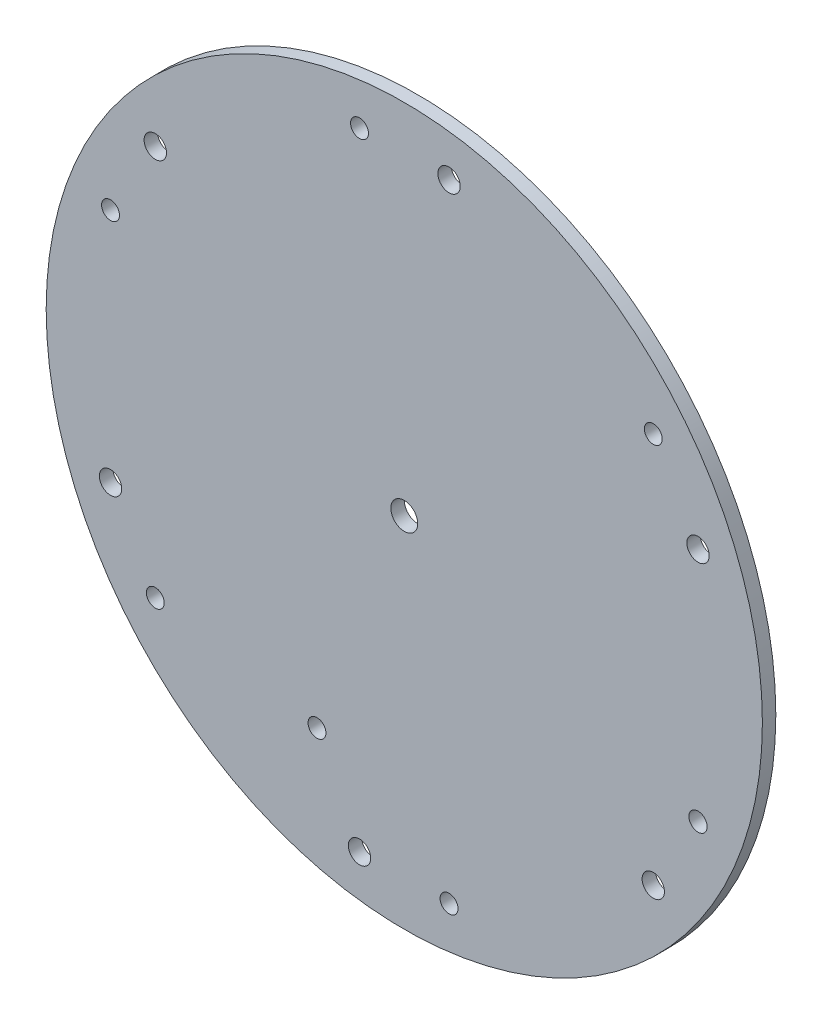
ISO-10303-21;
HEADER;
FILE_DESCRIPTION(('STEP AP214'),'2;1');
FILE_NAME('part.step','',(''),(''),'','','');
FILE_SCHEMA(('AUTOMOTIVE_DESIGN { 1 0 10303 214 1 1 1 1 }'));
ENDSEC;
DATA;
#1=APPLICATION_CONTEXT('core data for automotive mechanical design processes');
#2=APPLICATION_PROTOCOL_DEFINITION('international standard','automotive_design',2000,#1);
#3=PRODUCT_CONTEXT('',#1,'mechanical');
#4=PRODUCT('Part','Part','',(#3));
#5=PRODUCT_RELATED_PRODUCT_CATEGORY('part','',(#4));
#6=PRODUCT_DEFINITION_FORMATION('','',#4);
#7=PRODUCT_DEFINITION_CONTEXT('part definition',#1,'design');
#8=PRODUCT_DEFINITION('design','',#6,#7);
#9=PRODUCT_DEFINITION_SHAPE('','',#8);
#10=(LENGTH_UNIT() NAMED_UNIT(*) SI_UNIT(.MILLI.,.METRE.));
#11=(NAMED_UNIT(*) PLANE_ANGLE_UNIT() SI_UNIT($,.RADIAN.));
#12=(NAMED_UNIT(*) SI_UNIT($,.STERADIAN.) SOLID_ANGLE_UNIT());
#13=UNCERTAINTY_MEASURE_WITH_UNIT(LENGTH_MEASURE(1.E-05),#10,'distance_accuracy_value','');
#14=(GEOMETRIC_REPRESENTATION_CONTEXT(3) GLOBAL_UNCERTAINTY_ASSIGNED_CONTEXT((#13)) GLOBAL_UNIT_ASSIGNED_CONTEXT((#10,
#11,#12)) REPRESENTATION_CONTEXT('',''));
#15=CARTESIAN_POINT('',(0.,0.,0.));
#16=DIRECTION('',(0.,0.,1.));
#17=DIRECTION('',(1.,0.,0.));
#18=AXIS2_PLACEMENT_3D('',#15,#16,#17);
#19=CARTESIAN_POINT('',(2197.59378810527,1488.61532460832,3.));
#20=DIRECTION('',(0.,0.,1.));
#21=DIRECTION('',(1.,0.,0.));
#22=AXIS2_PLACEMENT_3D('',#19,#20,#21);
#23=PLANE('',#22);
#24=CARTESIAN_POINT('',(2263.21556637018,1514.95507057047,3.));
#25=DIRECTION('',(0.,0.,1.));
#26=DIRECTION('',(1.,0.,0.));
#27=AXIS2_PLACEMENT_3D('',#24,#25,#26);
#28=CIRCLE('',#27,2.5000000000001);
#29=CARTESIAN_POINT('',(2265.71556637018,1514.95507057047,3.));
#30=VERTEX_POINT('',#29);
#31=EDGE_CURVE('E114',#30,#30,#28,.T.);
#32=ORIENTED_EDGE('',*,*,#31,.F.);
#33=EDGE_LOOP('',(#32));
#34=FACE_BOUND('',#33,.T.);
#35=CARTESIAN_POINT('',(2253.21556637018,1444.95507057047,3.));
#36=DIRECTION('',(0.,0.,1.));
#37=DIRECTION('',(1.,0.,0.));
#38=AXIS2_PLACEMENT_3D('',#35,#36,#37);
#39=CIRCLE('',#38,2.5000000000001);
#40=CARTESIAN_POINT('',(2255.71556637018,1444.95507057047,3.));
#41=VERTEX_POINT('',#40);
#42=EDGE_CURVE('E102',#41,#41,#39,.T.);
#43=ORIENTED_EDGE('',*,*,#42,.F.);
#44=EDGE_LOOP('',(#43));
#45=FACE_BOUND('',#44,.T.);
#46=CARTESIAN_POINT('',(2187.59378810527,1418.61532460832,3.));
#47=DIRECTION('',(0.,0.,1.));
#48=DIRECTION('',(1.,0.,0.));
#49=AXIS2_PLACEMENT_3D('',#46,#47,#48);
#50=CIRCLE('',#49,2.50000000000016);
#51=CARTESIAN_POINT('',(2190.09378810527,1418.61532460832,3.));
#52=VERTEX_POINT('',#51);
#53=EDGE_CURVE('E90',#52,#52,#50,.T.);
#54=ORIENTED_EDGE('',*,*,#53,.F.);
#55=EDGE_LOOP('',(#54));
#56=FACE_BOUND('',#55,.T.);
#57=CARTESIAN_POINT('',(2141.97200984035,1444.95507057047,3.));
#58=DIRECTION('',(0.,0.,1.));
#59=DIRECTION('',(1.,0.,0.));
#60=AXIS2_PLACEMENT_3D('',#57,#58,#59);
#61=CIRCLE('',#60,1.99999999999968);
#62=CARTESIAN_POINT('',(2143.97200984035,1444.95507057047,3.));
#63=VERTEX_POINT('',#62);
#64=EDGE_CURVE('E78',#63,#63,#61,.T.);
#65=ORIENTED_EDGE('',*,*,#64,.F.);
#66=EDGE_LOOP('',(#65));
#67=FACE_BOUND('',#66,.T.);
#68=CARTESIAN_POINT('',(2131.97200984035,1514.95507057047,3.));
#69=DIRECTION('',(0.,0.,1.));
#70=DIRECTION('',(1.,0.,0.));
#71=AXIS2_PLACEMENT_3D('',#68,#69,#70);
#72=CIRCLE('',#71,1.99999999999961);
#73=CARTESIAN_POINT('',(2133.97200984035,1514.95507057047,3.));
#74=VERTEX_POINT('',#73);
#75=EDGE_CURVE('E66',#74,#74,#72,.T.);
#76=ORIENTED_EDGE('',*,*,#75,.F.);
#77=EDGE_LOOP('',(#76));
#78=FACE_BOUND('',#77,.T.);
#79=CARTESIAN_POINT('',(2141.97200984035,1532.27557864616,3.));
#80=DIRECTION('',(0.,0.,1.));
#81=DIRECTION('',(1.,0.,0.));
#82=AXIS2_PLACEMENT_3D('',#79,#80,#81);
#83=CIRCLE('',#82,2.49999999999967);
#84=CARTESIAN_POINT('',(2144.47200984035,1532.27557864616,3.));
#85=VERTEX_POINT('',#84);
#86=EDGE_CURVE('E54',#85,#85,#83,.T.);
#87=ORIENTED_EDGE('',*,*,#86,.F.);
#88=EDGE_LOOP('',(#87));
#89=FACE_BOUND('',#88,.T.);
#90=CARTESIAN_POINT('',(2197.59378810527,1488.61532460832,3.));
#91=DIRECTION('',(0.,0.,1.));
#92=DIRECTION('',(1.,0.,0.));
#93=AXIS2_PLACEMENT_3D('',#90,#91,#92);
#94=CIRCLE('',#93,3.00000000000015);
#95=CARTESIAN_POINT('',(2200.59378810527,1488.61532460832,3.));
#96=VERTEX_POINT('',#95);
#97=EDGE_CURVE('E43',#96,#96,#94,.T.);
#98=ORIENTED_EDGE('',*,*,#97,.F.);
#99=EDGE_LOOP('',(#98));
#100=FACE_BOUND('',#99,.T.);
#101=CARTESIAN_POINT('',(2197.59378810527,1488.61532460832,3.));
#102=DIRECTION('',(0.,0.,1.));
#103=DIRECTION('',(1.,0.,0.));
#104=AXIS2_PLACEMENT_3D('',#101,#102,#103);
#105=CIRCLE('',#104,80.0000000000003);
#106=CARTESIAN_POINT('',(2277.59378810527,1488.61532460832,3.));
#107=VERTEX_POINT('',#106);
#108=EDGE_CURVE('E10',#107,#107,#105,.T.);
#109=ORIENTED_EDGE('',*,*,#108,.T.);
#110=EDGE_LOOP('',(#109));
#111=FACE_BOUND('',#110,.T.);
#112=CARTESIAN_POINT('',(2187.59378810527,1558.61532460832,3.));
#113=DIRECTION('',(0.,0.,1.));
#114=DIRECTION('',(1.,0.,0.));
#115=AXIS2_PLACEMENT_3D('',#112,#113,#114);
#116=CIRCLE('',#115,1.99999999999968);
#117=CARTESIAN_POINT('',(2189.59378810527,1558.61532460832,3.));
#118=VERTEX_POINT('',#117);
#119=EDGE_CURVE('E48',#118,#118,#116,.T.);
#120=ORIENTED_EDGE('',*,*,#119,.F.);
#121=EDGE_LOOP('',(#120));
#122=FACE_BOUND('',#121,.T.);
#123=CARTESIAN_POINT('',(2207.59378810527,1558.61532460832,3.));
#124=DIRECTION('',(0.,0.,1.));
#125=DIRECTION('',(1.,0.,0.));
#126=AXIS2_PLACEMENT_3D('',#123,#124,#125);
#127=CIRCLE('',#126,2.5000000000001);
#128=CARTESIAN_POINT('',(2210.09378810527,1558.61532460832,3.));
#129=VERTEX_POINT('',#128);
#130=EDGE_CURVE('E60',#129,#129,#127,.T.);
#131=ORIENTED_EDGE('',*,*,#130,.F.);
#132=EDGE_LOOP('',(#131));
#133=FACE_BOUND('',#132,.T.);
#134=CARTESIAN_POINT('',(2131.97200984035,1462.27557864616,3.));
#135=DIRECTION('',(0.,0.,1.));
#136=DIRECTION('',(1.,0.,0.));
#137=AXIS2_PLACEMENT_3D('',#134,#135,#136);
#138=CIRCLE('',#137,2.5000000000001);
#139=CARTESIAN_POINT('',(2134.47200984035,1462.27557864616,3.));
#140=VERTEX_POINT('',#139);
#141=EDGE_CURVE('E72',#140,#140,#138,.T.);
#142=ORIENTED_EDGE('',*,*,#141,.F.);
#143=EDGE_LOOP('',(#142));
#144=FACE_BOUND('',#143,.T.);
#145=CARTESIAN_POINT('',(2178.09378810527,1437.83622883643,3.));
#146=DIRECTION('',(0.,0.,1.));
#147=DIRECTION('',(1.,0.,0.));
#148=AXIS2_PLACEMENT_3D('',#145,#146,#147);
#149=CIRCLE('',#148,1.99999999999968);
#150=CARTESIAN_POINT('',(2180.09378810527,1437.83622883643,3.));
#151=VERTEX_POINT('',#150);
#152=EDGE_CURVE('E84',#151,#151,#149,.T.);
#153=ORIENTED_EDGE('',*,*,#152,.F.);
#154=EDGE_LOOP('',(#153));
#155=FACE_BOUND('',#154,.T.);
#156=CARTESIAN_POINT('',(2207.59378810527,1418.61532460832,3.));
#157=DIRECTION('',(0.,0.,1.));
#158=DIRECTION('',(1.,0.,0.));
#159=AXIS2_PLACEMENT_3D('',#156,#157,#158);
#160=CIRCLE('',#159,1.99999999999968);
#161=CARTESIAN_POINT('',(2209.59378810527,1418.61532460832,3.));
#162=VERTEX_POINT('',#161);
#163=EDGE_CURVE('E96',#162,#162,#160,.T.);
#164=ORIENTED_EDGE('',*,*,#163,.F.);
#165=EDGE_LOOP('',(#164));
#166=FACE_BOUND('',#165,.T.);
#167=CARTESIAN_POINT('',(2263.21556637018,1462.27557864616,3.));
#168=DIRECTION('',(0.,0.,1.));
#169=DIRECTION('',(1.,0.,0.));
#170=AXIS2_PLACEMENT_3D('',#167,#168,#169);
#171=CIRCLE('',#170,2.03949019728253);
#172=CARTESIAN_POINT('',(2265.25505656746,1462.27557864616,3.));
#173=VERTEX_POINT('',#172);
#174=EDGE_CURVE('E108',#173,#173,#171,.T.);
#175=ORIENTED_EDGE('',*,*,#174,.F.);
#176=EDGE_LOOP('',(#175));
#177=FACE_BOUND('',#176,.T.);
#178=CARTESIAN_POINT('',(2253.21556637018,1532.27557864616,3.));
#179=DIRECTION('',(0.,0.,1.));
#180=DIRECTION('',(1.,0.,0.));
#181=AXIS2_PLACEMENT_3D('',#178,#179,#180);
#182=CIRCLE('',#181,1.99999999999968);
#183=CARTESIAN_POINT('',(2255.21556637018,1532.27557864616,3.));
#184=VERTEX_POINT('',#183);
#185=EDGE_CURVE('E120',#184,#184,#182,.T.);
#186=ORIENTED_EDGE('',*,*,#185,.F.);
#187=EDGE_LOOP('',(#186));
#188=FACE_BOUND('',#187,.T.);
#189=ADVANCED_FACE('F32',(#34,#45,#56,#67,#78,#89,#100,#111,#122,#133,#144,#155,#166,#177,#188),
#23,.T.);
#190=CARTESIAN_POINT('',(2197.59378810527,1488.61532460832,0.));
#191=DIRECTION('',(0.,0.,1.));
#192=DIRECTION('',(1.,0.,0.));
#193=AXIS2_PLACEMENT_3D('',#190,#191,#192);
#194=PLANE('',#193);
#195=CARTESIAN_POINT('',(2197.59378810527,1488.61532460832,0.));
#196=DIRECTION('',(0.,0.,1.));
#197=DIRECTION('',(1.,0.,0.));
#198=AXIS2_PLACEMENT_3D('',#195,#196,#197);
#199=CIRCLE('',#198,80.0000000000003);
#200=CARTESIAN_POINT('',(2277.59378810527,1488.61532460832,0.));
#201=VERTEX_POINT('',#200);
#202=EDGE_CURVE('E36',#201,#201,#199,.T.);
#203=ORIENTED_EDGE('',*,*,#202,.F.);
#204=EDGE_LOOP('',(#203));
#205=FACE_BOUND('',#204,.T.);
#206=CARTESIAN_POINT('',(2197.59378810527,1488.61532460832,0.));
#207=DIRECTION('',(0.,0.,1.));
#208=DIRECTION('',(1.,0.,0.));
#209=AXIS2_PLACEMENT_3D('',#206,#207,#208);
#210=CIRCLE('',#209,3.00000000000015);
#211=CARTESIAN_POINT('',(2200.59378810527,1488.61532460832,0.));
#212=VERTEX_POINT('',#211);
#213=EDGE_CURVE('E45',#212,#212,#210,.T.);
#214=ORIENTED_EDGE('',*,*,#213,.T.);
#215=EDGE_LOOP('',(#214));
#216=FACE_BOUND('',#215,.T.);
#217=CARTESIAN_POINT('',(2187.59378810527,1558.61532460832,0.));
#218=DIRECTION('',(0.,0.,1.));
#219=DIRECTION('',(1.,0.,0.));
#220=AXIS2_PLACEMENT_3D('',#217,#218,#219);
#221=CIRCLE('',#220,1.99999999999968);
#222=CARTESIAN_POINT('',(2189.59378810527,1558.61532460832,0.));
#223=VERTEX_POINT('',#222);
#224=EDGE_CURVE('E51',#223,#223,#221,.T.);
#225=ORIENTED_EDGE('',*,*,#224,.T.);
#226=EDGE_LOOP('',(#225));
#227=FACE_BOUND('',#226,.T.);
#228=CARTESIAN_POINT('',(2141.97200984035,1532.27557864616,0.));
#229=DIRECTION('',(0.,0.,1.));
#230=DIRECTION('',(1.,0.,0.));
#231=AXIS2_PLACEMENT_3D('',#228,#229,#230);
#232=CIRCLE('',#231,2.49999999999967);
#233=CARTESIAN_POINT('',(2144.47200984035,1532.27557864616,0.));
#234=VERTEX_POINT('',#233);
#235=EDGE_CURVE('E57',#234,#234,#232,.T.);
#236=ORIENTED_EDGE('',*,*,#235,.T.);
#237=EDGE_LOOP('',(#236));
#238=FACE_BOUND('',#237,.T.);
#239=CARTESIAN_POINT('',(2207.59378810527,1558.61532460832,0.));
#240=DIRECTION('',(0.,0.,1.));
#241=DIRECTION('',(1.,0.,0.));
#242=AXIS2_PLACEMENT_3D('',#239,#240,#241);
#243=CIRCLE('',#242,2.5000000000001);
#244=CARTESIAN_POINT('',(2210.09378810527,1558.61532460832,0.));
#245=VERTEX_POINT('',#244);
#246=EDGE_CURVE('E63',#245,#245,#243,.T.);
#247=ORIENTED_EDGE('',*,*,#246,.T.);
#248=EDGE_LOOP('',(#247));
#249=FACE_BOUND('',#248,.T.);
#250=CARTESIAN_POINT('',(2131.97200984035,1514.95507057047,0.));
#251=DIRECTION('',(0.,0.,1.));
#252=DIRECTION('',(1.,0.,0.));
#253=AXIS2_PLACEMENT_3D('',#250,#251,#252);
#254=CIRCLE('',#253,1.99999999999961);
#255=CARTESIAN_POINT('',(2133.97200984035,1514.95507057047,0.));
#256=VERTEX_POINT('',#255);
#257=EDGE_CURVE('E69',#256,#256,#254,.T.);
#258=ORIENTED_EDGE('',*,*,#257,.T.);
#259=EDGE_LOOP('',(#258));
#260=FACE_BOUND('',#259,.T.);
#261=CARTESIAN_POINT('',(2131.97200984035,1462.27557864616,0.));
#262=DIRECTION('',(0.,0.,1.));
#263=DIRECTION('',(1.,0.,0.));
#264=AXIS2_PLACEMENT_3D('',#261,#262,#263);
#265=CIRCLE('',#264,2.5000000000001);
#266=CARTESIAN_POINT('',(2134.47200984035,1462.27557864616,0.));
#267=VERTEX_POINT('',#266);
#268=EDGE_CURVE('E75',#267,#267,#265,.T.);
#269=ORIENTED_EDGE('',*,*,#268,.T.);
#270=EDGE_LOOP('',(#269));
#271=FACE_BOUND('',#270,.T.);
#272=CARTESIAN_POINT('',(2141.97200984035,1444.95507057047,0.));
#273=DIRECTION('',(0.,0.,1.));
#274=DIRECTION('',(1.,0.,0.));
#275=AXIS2_PLACEMENT_3D('',#272,#273,#274);
#276=CIRCLE('',#275,1.99999999999968);
#277=CARTESIAN_POINT('',(2143.97200984035,1444.95507057047,0.));
#278=VERTEX_POINT('',#277);
#279=EDGE_CURVE('E81',#278,#278,#276,.T.);
#280=ORIENTED_EDGE('',*,*,#279,.T.);
#281=EDGE_LOOP('',(#280));
#282=FACE_BOUND('',#281,.T.);
#283=CARTESIAN_POINT('',(2178.09378810527,1437.83622883643,0.));
#284=DIRECTION('',(0.,0.,1.));
#285=DIRECTION('',(1.,0.,0.));
#286=AXIS2_PLACEMENT_3D('',#283,#284,#285);
#287=CIRCLE('',#286,1.99999999999968);
#288=CARTESIAN_POINT('',(2180.09378810527,1437.83622883643,0.));
#289=VERTEX_POINT('',#288);
#290=EDGE_CURVE('E87',#289,#289,#287,.T.);
#291=ORIENTED_EDGE('',*,*,#290,.T.);
#292=EDGE_LOOP('',(#291));
#293=FACE_BOUND('',#292,.T.);
#294=CARTESIAN_POINT('',(2187.59378810527,1418.61532460832,0.));
#295=DIRECTION('',(0.,0.,1.));
#296=DIRECTION('',(1.,0.,0.));
#297=AXIS2_PLACEMENT_3D('',#294,#295,#296);
#298=CIRCLE('',#297,2.50000000000016);
#299=CARTESIAN_POINT('',(2190.09378810527,1418.61532460832,0.));
#300=VERTEX_POINT('',#299);
#301=EDGE_CURVE('E93',#300,#300,#298,.T.);
#302=ORIENTED_EDGE('',*,*,#301,.T.);
#303=EDGE_LOOP('',(#302));
#304=FACE_BOUND('',#303,.T.);
#305=CARTESIAN_POINT('',(2207.59378810527,1418.61532460832,0.));
#306=DIRECTION('',(0.,0.,1.));
#307=DIRECTION('',(1.,0.,0.));
#308=AXIS2_PLACEMENT_3D('',#305,#306,#307);
#309=CIRCLE('',#308,1.99999999999968);
#310=CARTESIAN_POINT('',(2209.59378810527,1418.61532460832,0.));
#311=VERTEX_POINT('',#310);
#312=EDGE_CURVE('E99',#311,#311,#309,.T.);
#313=ORIENTED_EDGE('',*,*,#312,.T.);
#314=EDGE_LOOP('',(#313));
#315=FACE_BOUND('',#314,.T.);
#316=CARTESIAN_POINT('',(2253.21556637018,1444.95507057047,0.));
#317=DIRECTION('',(0.,0.,1.));
#318=DIRECTION('',(1.,0.,0.));
#319=AXIS2_PLACEMENT_3D('',#316,#317,#318);
#320=CIRCLE('',#319,2.5000000000001);
#321=CARTESIAN_POINT('',(2255.71556637018,1444.95507057047,0.));
#322=VERTEX_POINT('',#321);
#323=EDGE_CURVE('E105',#322,#322,#320,.T.);
#324=ORIENTED_EDGE('',*,*,#323,.T.);
#325=EDGE_LOOP('',(#324));
#326=FACE_BOUND('',#325,.T.);
#327=CARTESIAN_POINT('',(2263.21556637018,1462.27557864616,0.));
#328=DIRECTION('',(0.,0.,1.));
#329=DIRECTION('',(1.,0.,0.));
#330=AXIS2_PLACEMENT_3D('',#327,#328,#329);
#331=CIRCLE('',#330,2.03949019728253);
#332=CARTESIAN_POINT('',(2265.25505656746,1462.27557864616,0.));
#333=VERTEX_POINT('',#332);
#334=EDGE_CURVE('E111',#333,#333,#331,.T.);
#335=ORIENTED_EDGE('',*,*,#334,.T.);
#336=EDGE_LOOP('',(#335));
#337=FACE_BOUND('',#336,.T.);
#338=CARTESIAN_POINT('',(2263.21556637018,1514.95507057047,0.));
#339=DIRECTION('',(0.,0.,1.));
#340=DIRECTION('',(1.,0.,0.));
#341=AXIS2_PLACEMENT_3D('',#338,#339,#340);
#342=CIRCLE('',#341,2.5000000000001);
#343=CARTESIAN_POINT('',(2265.71556637018,1514.95507057047,0.));
#344=VERTEX_POINT('',#343);
#345=EDGE_CURVE('E117',#344,#344,#342,.T.);
#346=ORIENTED_EDGE('',*,*,#345,.T.);
#347=EDGE_LOOP('',(#346));
#348=FACE_BOUND('',#347,.T.);
#349=CARTESIAN_POINT('',(2253.21556637018,1532.27557864616,0.));
#350=DIRECTION('',(0.,0.,1.));
#351=DIRECTION('',(1.,0.,0.));
#352=AXIS2_PLACEMENT_3D('',#349,#350,#351);
#353=CIRCLE('',#352,1.99999999999968);
#354=CARTESIAN_POINT('',(2255.21556637018,1532.27557864616,0.));
#355=VERTEX_POINT('',#354);
#356=EDGE_CURVE('E123',#355,#355,#353,.T.);
#357=ORIENTED_EDGE('',*,*,#356,.T.);
#358=EDGE_LOOP('',(#357));
#359=FACE_BOUND('',#358,.T.);
#360=ADVANCED_FACE('F133',(#205,#216,#227,#238,#249,#260,#271,#282,#293,#304,#315,#326,#337,
#348,#359),#194,.F.);
#361=CARTESIAN_POINT('',(2197.59378810527,1488.61532460832,3.));
#362=DIRECTION('',(0.,0.,-1.));
#363=DIRECTION('',(-1.,0.,0.));
#364=AXIS2_PLACEMENT_3D('',#361,#362,#363);
#365=CYLINDRICAL_SURFACE('',#364,80.0000000000003);
#366=ORIENTED_EDGE('',*,*,#108,.F.);
#367=EDGE_LOOP('',(#366));
#368=FACE_BOUND('',#367,.T.);
#369=ORIENTED_EDGE('',*,*,#202,.T.);
#370=EDGE_LOOP('',(#369));
#371=FACE_BOUND('',#370,.T.);
#372=ADVANCED_FACE('F34',(#368,#371),#365,.T.);
#373=CARTESIAN_POINT('',(2197.59378810527,1488.61532460832,3.));
#374=DIRECTION('',(0.,0.,-1.));
#375=DIRECTION('',(-1.,0.,0.));
#376=AXIS2_PLACEMENT_3D('',#373,#374,#375);
#377=CYLINDRICAL_SURFACE('',#376,3.00000000000015);
#378=ORIENTED_EDGE('',*,*,#97,.T.);
#379=EDGE_LOOP('',(#378));
#380=FACE_BOUND('',#379,.T.);
#381=ORIENTED_EDGE('',*,*,#213,.F.);
#382=EDGE_LOOP('',(#381));
#383=FACE_BOUND('',#382,.T.);
#384=ADVANCED_FACE('F143',(#380,#383),#377,.F.);
#385=CARTESIAN_POINT('',(2187.59378810527,1558.61532460832,3.));
#386=DIRECTION('',(0.,0.,-1.));
#387=DIRECTION('',(-1.,0.,0.));
#388=AXIS2_PLACEMENT_3D('',#385,#386,#387);
#389=CYLINDRICAL_SURFACE('',#388,1.99999999999968);
#390=ORIENTED_EDGE('',*,*,#119,.T.);
#391=EDGE_LOOP('',(#390));
#392=FACE_BOUND('',#391,.T.);
#393=ORIENTED_EDGE('',*,*,#224,.F.);
#394=EDGE_LOOP('',(#393));
#395=FACE_BOUND('',#394,.T.);
#396=ADVANCED_FACE('F146',(#392,#395),#389,.F.);
#397=CARTESIAN_POINT('',(2141.97200984035,1532.27557864616,3.));
#398=DIRECTION('',(0.,0.,-1.));
#399=DIRECTION('',(-1.,0.,0.));
#400=AXIS2_PLACEMENT_3D('',#397,#398,#399);
#401=CYLINDRICAL_SURFACE('',#400,2.49999999999967);
#402=ORIENTED_EDGE('',*,*,#86,.T.);
#403=EDGE_LOOP('',(#402));
#404=FACE_BOUND('',#403,.T.);
#405=ORIENTED_EDGE('',*,*,#235,.F.);
#406=EDGE_LOOP('',(#405));
#407=FACE_BOUND('',#406,.T.);
#408=ADVANCED_FACE('F150',(#404,#407),#401,.F.);
#409=CARTESIAN_POINT('',(2207.59378810527,1558.61532460832,3.));
#410=DIRECTION('',(0.,0.,-1.));
#411=DIRECTION('',(-1.,0.,0.));
#412=AXIS2_PLACEMENT_3D('',#409,#410,#411);
#413=CYLINDRICAL_SURFACE('',#412,2.5000000000001);
#414=ORIENTED_EDGE('',*,*,#130,.T.);
#415=EDGE_LOOP('',(#414));
#416=FACE_BOUND('',#415,.T.);
#417=ORIENTED_EDGE('',*,*,#246,.F.);
#418=EDGE_LOOP('',(#417));
#419=FACE_BOUND('',#418,.T.);
#420=ADVANCED_FACE('F154',(#416,#419),#413,.F.);
#421=CARTESIAN_POINT('',(2131.97200984035,1514.95507057047,3.));
#422=DIRECTION('',(0.,0.,-1.));
#423=DIRECTION('',(-1.,0.,0.));
#424=AXIS2_PLACEMENT_3D('',#421,#422,#423);
#425=CYLINDRICAL_SURFACE('',#424,1.99999999999961);
#426=ORIENTED_EDGE('',*,*,#75,.T.);
#427=EDGE_LOOP('',(#426));
#428=FACE_BOUND('',#427,.T.);
#429=ORIENTED_EDGE('',*,*,#257,.F.);
#430=EDGE_LOOP('',(#429));
#431=FACE_BOUND('',#430,.T.);
#432=ADVANCED_FACE('F158',(#428,#431),#425,.F.);
#433=CARTESIAN_POINT('',(2131.97200984035,1462.27557864616,3.));
#434=DIRECTION('',(0.,0.,-1.));
#435=DIRECTION('',(-1.,0.,0.));
#436=AXIS2_PLACEMENT_3D('',#433,#434,#435);
#437=CYLINDRICAL_SURFACE('',#436,2.5000000000001);
#438=ORIENTED_EDGE('',*,*,#141,.T.);
#439=EDGE_LOOP('',(#438));
#440=FACE_BOUND('',#439,.T.);
#441=ORIENTED_EDGE('',*,*,#268,.F.);
#442=EDGE_LOOP('',(#441));
#443=FACE_BOUND('',#442,.T.);
#444=ADVANCED_FACE('F162',(#440,#443),#437,.F.);
#445=CARTESIAN_POINT('',(2141.97200984035,1444.95507057047,3.));
#446=DIRECTION('',(0.,0.,-1.));
#447=DIRECTION('',(-1.,0.,0.));
#448=AXIS2_PLACEMENT_3D('',#445,#446,#447);
#449=CYLINDRICAL_SURFACE('',#448,1.99999999999968);
#450=ORIENTED_EDGE('',*,*,#64,.T.);
#451=EDGE_LOOP('',(#450));
#452=FACE_BOUND('',#451,.T.);
#453=ORIENTED_EDGE('',*,*,#279,.F.);
#454=EDGE_LOOP('',(#453));
#455=FACE_BOUND('',#454,.T.);
#456=ADVANCED_FACE('F166',(#452,#455),#449,.F.);
#457=CARTESIAN_POINT('',(2178.09378810527,1437.83622883643,3.));
#458=DIRECTION('',(0.,0.,-1.));
#459=DIRECTION('',(-1.,0.,0.));
#460=AXIS2_PLACEMENT_3D('',#457,#458,#459);
#461=CYLINDRICAL_SURFACE('',#460,1.99999999999968);
#462=ORIENTED_EDGE('',*,*,#152,.T.);
#463=EDGE_LOOP('',(#462));
#464=FACE_BOUND('',#463,.T.);
#465=ORIENTED_EDGE('',*,*,#290,.F.);
#466=EDGE_LOOP('',(#465));
#467=FACE_BOUND('',#466,.T.);
#468=ADVANCED_FACE('F170',(#464,#467),#461,.F.);
#469=CARTESIAN_POINT('',(2187.59378810527,1418.61532460832,3.));
#470=DIRECTION('',(0.,0.,-1.));
#471=DIRECTION('',(-1.,0.,0.));
#472=AXIS2_PLACEMENT_3D('',#469,#470,#471);
#473=CYLINDRICAL_SURFACE('',#472,2.50000000000016);
#474=ORIENTED_EDGE('',*,*,#53,.T.);
#475=EDGE_LOOP('',(#474));
#476=FACE_BOUND('',#475,.T.);
#477=ORIENTED_EDGE('',*,*,#301,.F.);
#478=EDGE_LOOP('',(#477));
#479=FACE_BOUND('',#478,.T.);
#480=ADVANCED_FACE('F174',(#476,#479),#473,.F.);
#481=CARTESIAN_POINT('',(2207.59378810527,1418.61532460832,3.));
#482=DIRECTION('',(0.,0.,-1.));
#483=DIRECTION('',(-1.,0.,0.));
#484=AXIS2_PLACEMENT_3D('',#481,#482,#483);
#485=CYLINDRICAL_SURFACE('',#484,1.99999999999968);
#486=ORIENTED_EDGE('',*,*,#163,.T.);
#487=EDGE_LOOP('',(#486));
#488=FACE_BOUND('',#487,.T.);
#489=ORIENTED_EDGE('',*,*,#312,.F.);
#490=EDGE_LOOP('',(#489));
#491=FACE_BOUND('',#490,.T.);
#492=ADVANCED_FACE('F178',(#488,#491),#485,.F.);
#493=CARTESIAN_POINT('',(2253.21556637018,1444.95507057047,3.));
#494=DIRECTION('',(0.,0.,-1.));
#495=DIRECTION('',(-1.,0.,0.));
#496=AXIS2_PLACEMENT_3D('',#493,#494,#495);
#497=CYLINDRICAL_SURFACE('',#496,2.5000000000001);
#498=ORIENTED_EDGE('',*,*,#42,.T.);
#499=EDGE_LOOP('',(#498));
#500=FACE_BOUND('',#499,.T.);
#501=ORIENTED_EDGE('',*,*,#323,.F.);
#502=EDGE_LOOP('',(#501));
#503=FACE_BOUND('',#502,.T.);
#504=ADVANCED_FACE('F182',(#500,#503),#497,.F.);
#505=CARTESIAN_POINT('',(2263.21556637018,1462.27557864616,3.));
#506=DIRECTION('',(0.,0.,-1.));
#507=DIRECTION('',(-1.,0.,0.));
#508=AXIS2_PLACEMENT_3D('',#505,#506,#507);
#509=CYLINDRICAL_SURFACE('',#508,2.03949019728253);
#510=ORIENTED_EDGE('',*,*,#174,.T.);
#511=EDGE_LOOP('',(#510));
#512=FACE_BOUND('',#511,.T.);
#513=ORIENTED_EDGE('',*,*,#334,.F.);
#514=EDGE_LOOP('',(#513));
#515=FACE_BOUND('',#514,.T.);
#516=ADVANCED_FACE('F186',(#512,#515),#509,.F.);
#517=CARTESIAN_POINT('',(2263.21556637018,1514.95507057047,3.));
#518=DIRECTION('',(0.,0.,-1.));
#519=DIRECTION('',(-1.,0.,0.));
#520=AXIS2_PLACEMENT_3D('',#517,#518,#519);
#521=CYLINDRICAL_SURFACE('',#520,2.5000000000001);
#522=ORIENTED_EDGE('',*,*,#31,.T.);
#523=EDGE_LOOP('',(#522));
#524=FACE_BOUND('',#523,.T.);
#525=ORIENTED_EDGE('',*,*,#345,.F.);
#526=EDGE_LOOP('',(#525));
#527=FACE_BOUND('',#526,.T.);
#528=ADVANCED_FACE('F190',(#524,#527),#521,.F.);
#529=CARTESIAN_POINT('',(2253.21556637018,1532.27557864616,3.));
#530=DIRECTION('',(0.,0.,-1.));
#531=DIRECTION('',(-1.,0.,0.));
#532=AXIS2_PLACEMENT_3D('',#529,#530,#531);
#533=CYLINDRICAL_SURFACE('',#532,1.99999999999968);
#534=ORIENTED_EDGE('',*,*,#185,.T.);
#535=EDGE_LOOP('',(#534));
#536=FACE_BOUND('',#535,.T.);
#537=ORIENTED_EDGE('',*,*,#356,.F.);
#538=EDGE_LOOP('',(#537));
#539=FACE_BOUND('',#538,.T.);
#540=ADVANCED_FACE('F129',(#536,#539),#533,.F.);
#541=CLOSED_SHELL('',(#189,#360,#372,#384,#396,#408,#420,#432,#444,#456,#468,#480,#492,#504,
#516,#528,#540));
#542=MANIFOLD_SOLID_BREP('B2',#541);
#543=ADVANCED_BREP_SHAPE_REPRESENTATION('',(#18,#542),#14);
#544=SHAPE_DEFINITION_REPRESENTATION(#9,#543);
ENDSEC;
END-ISO-10303-21;
